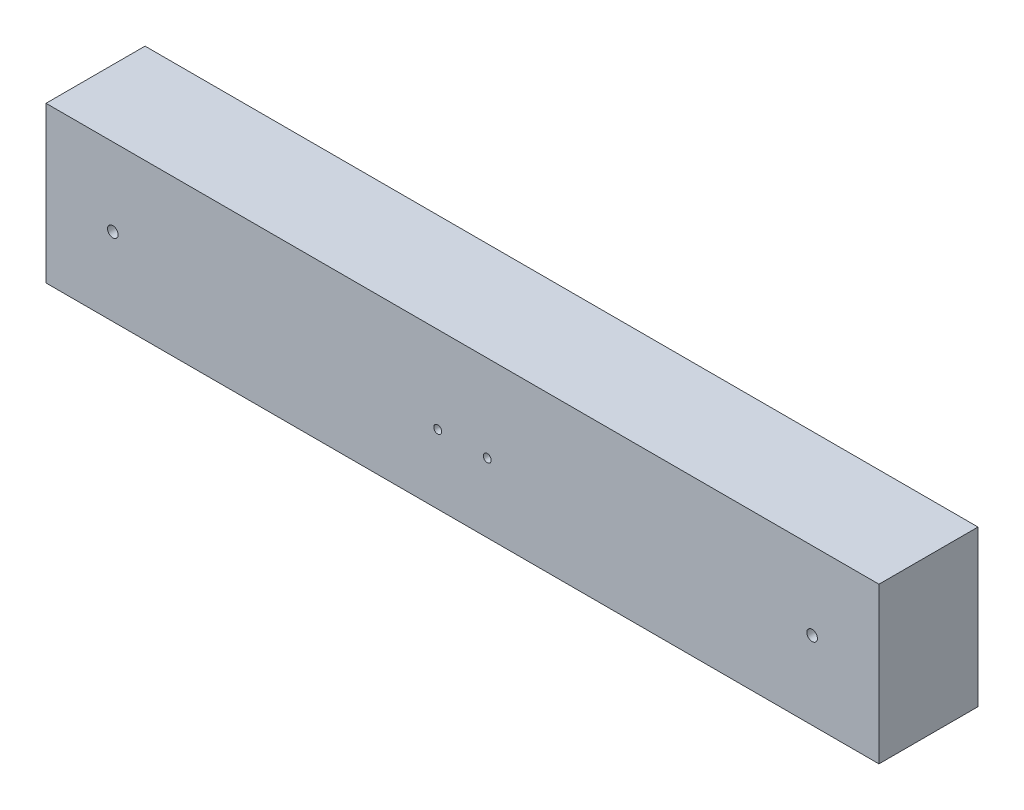
ISO-10303-21;
HEADER;
FILE_DESCRIPTION(('STEP AP214'),'2;1');
FILE_NAME('part.step','',(''),(''),'','','');
FILE_SCHEMA(('AUTOMOTIVE_DESIGN { 1 0 10303 214 1 1 1 1 }'));
ENDSEC;
DATA;
#1=APPLICATION_CONTEXT('core data for automotive mechanical design processes');
#2=APPLICATION_PROTOCOL_DEFINITION('international standard','automotive_design',2000,#1);
#3=PRODUCT_CONTEXT('',#1,'mechanical');
#4=PRODUCT('Part','Part','',(#3));
#5=PRODUCT_RELATED_PRODUCT_CATEGORY('part','',(#4));
#6=PRODUCT_DEFINITION_FORMATION('','',#4);
#7=PRODUCT_DEFINITION_CONTEXT('part definition',#1,'design');
#8=PRODUCT_DEFINITION('design','',#6,#7);
#9=PRODUCT_DEFINITION_SHAPE('','',#8);
#10=(LENGTH_UNIT() NAMED_UNIT(*) SI_UNIT(.MILLI.,.METRE.));
#11=(NAMED_UNIT(*) PLANE_ANGLE_UNIT() SI_UNIT($,.RADIAN.));
#12=(NAMED_UNIT(*) SI_UNIT($,.STERADIAN.) SOLID_ANGLE_UNIT());
#13=UNCERTAINTY_MEASURE_WITH_UNIT(LENGTH_MEASURE(1.E-05),#10,'distance_accuracy_value','');
#14=(GEOMETRIC_REPRESENTATION_CONTEXT(3) GLOBAL_UNCERTAINTY_ASSIGNED_CONTEXT((#13)) GLOBAL_UNIT_ASSIGNED_CONTEXT((#10,
#11,#12)) REPRESENTATION_CONTEXT('',''));
#15=CARTESIAN_POINT('',(0.,0.,0.));
#16=DIRECTION('',(0.,0.,1.));
#17=DIRECTION('',(1.,0.,0.));
#18=AXIS2_PLACEMENT_3D('',#15,#16,#17);
#19=CARTESIAN_POINT('',(373.8626,-69.85,88.9));
#20=DIRECTION('',(-1.,0.,0.));
#21=DIRECTION('',(0.,0.,1.));
#22=AXIS2_PLACEMENT_3D('',#19,#20,#21);
#23=PLANE('',#22);
#24=DIRECTION('',(0.,1.,0.));
#25=VECTOR('',#24,1.);
#26=CARTESIAN_POINT('',(373.8626,-69.85,0.));
#27=LINE('',#26,#25);
#28=CARTESIAN_POINT('',(373.8626,-69.85,0.));
#29=VERTEX_POINT('',#28);
#30=CARTESIAN_POINT('',(373.8626,69.85,0.));
#31=VERTEX_POINT('',#30);
#32=EDGE_CURVE('E97',#29,#31,#27,.T.);
#33=ORIENTED_EDGE('',*,*,#32,.T.);
#34=DIRECTION('',(0.,0.,-1.));
#35=VECTOR('',#34,1.);
#36=CARTESIAN_POINT('',(373.8626,69.85,88.9));
#37=LINE('',#36,#35);
#38=CARTESIAN_POINT('',(373.8626,69.85,88.9));
#39=VERTEX_POINT('',#38);
#40=EDGE_CURVE('E11',#39,#31,#37,.T.);
#41=ORIENTED_EDGE('',*,*,#40,.F.);
#42=DIRECTION('',(0.,1.,0.));
#43=VECTOR('',#42,1.);
#44=CARTESIAN_POINT('',(373.8626,-69.85,88.9));
#45=LINE('',#44,#43);
#46=CARTESIAN_POINT('',(373.8626,-69.85,88.9));
#47=VERTEX_POINT('',#46);
#48=EDGE_CURVE('E85',#47,#39,#45,.T.);
#49=ORIENTED_EDGE('',*,*,#48,.F.);
#50=DIRECTION('',(0.,0.,-1.));
#51=VECTOR('',#50,1.);
#52=CARTESIAN_POINT('',(373.8626,-69.85,88.9));
#53=LINE('',#52,#51);
#54=EDGE_CURVE('E93',#47,#29,#53,.T.);
#55=ORIENTED_EDGE('',*,*,#54,.T.);
#56=EDGE_LOOP('',(#33,#41,#49,#55));
#57=FACE_BOUND('',#56,.T.);
#58=ADVANCED_FACE('F34',(#57),#23,.F.);
#59=CARTESIAN_POINT('',(-373.8626,69.85,88.9));
#60=DIRECTION('',(0.,-1.,0.));
#61=DIRECTION('',(0.,0.,-1.));
#62=AXIS2_PLACEMENT_3D('',#59,#60,#61);
#63=PLANE('',#62);
#64=DIRECTION('',(-1.,0.,0.));
#65=VECTOR('',#64,1.);
#66=CARTESIAN_POINT('',(-373.8626,69.85,0.));
#67=LINE('',#66,#65);
#68=CARTESIAN_POINT('',(-373.8626,69.85,0.));
#69=VERTEX_POINT('',#68);
#70=EDGE_CURVE('E89',#31,#69,#67,.T.);
#71=ORIENTED_EDGE('',*,*,#70,.T.);
#72=DIRECTION('',(0.,0.,-1.));
#73=VECTOR('',#72,1.);
#74=CARTESIAN_POINT('',(-373.8626,69.85,88.9));
#75=LINE('',#74,#73);
#76=CARTESIAN_POINT('',(-373.8626,69.85,88.9));
#77=VERTEX_POINT('',#76);
#78=EDGE_CURVE('E42',#77,#69,#75,.T.);
#79=ORIENTED_EDGE('',*,*,#78,.F.);
#80=DIRECTION('',(-1.,0.,0.));
#81=VECTOR('',#80,1.);
#82=CARTESIAN_POINT('',(-373.8626,69.85,88.9));
#83=LINE('',#82,#81);
#84=EDGE_CURVE('E80',#39,#77,#83,.T.);
#85=ORIENTED_EDGE('',*,*,#84,.F.);
#86=ORIENTED_EDGE('',*,*,#40,.T.);
#87=EDGE_LOOP('',(#71,#79,#85,#86));
#88=FACE_BOUND('',#87,.T.);
#89=ADVANCED_FACE('F88',(#88),#63,.F.);
#90=CARTESIAN_POINT('',(-373.8626,-69.85,88.9));
#91=DIRECTION('',(1.,0.,0.));
#92=DIRECTION('',(0.,0.,-1.));
#93=AXIS2_PLACEMENT_3D('',#90,#91,#92);
#94=PLANE('',#93);
#95=DIRECTION('',(0.,-1.,0.));
#96=VECTOR('',#95,1.);
#97=CARTESIAN_POINT('',(-373.8626,-69.85,0.));
#98=LINE('',#97,#96);
#99=CARTESIAN_POINT('',(-373.8626,-69.85,0.));
#100=VERTEX_POINT('',#99);
#101=EDGE_CURVE('E67',#69,#100,#98,.T.);
#102=ORIENTED_EDGE('',*,*,#101,.T.);
#103=DIRECTION('',(0.,0.,-1.));
#104=VECTOR('',#103,1.);
#105=CARTESIAN_POINT('',(-373.8626,-69.85,88.9));
#106=LINE('',#105,#104);
#107=CARTESIAN_POINT('',(-373.8626,-69.85,88.9));
#108=VERTEX_POINT('',#107);
#109=EDGE_CURVE('E90',#108,#100,#106,.T.);
#110=ORIENTED_EDGE('',*,*,#109,.F.);
#111=DIRECTION('',(0.,-1.,0.));
#112=VECTOR('',#111,1.);
#113=CARTESIAN_POINT('',(-373.8626,-69.85,88.9));
#114=LINE('',#113,#112);
#115=EDGE_CURVE('E83',#77,#108,#114,.T.);
#116=ORIENTED_EDGE('',*,*,#115,.F.);
#117=ORIENTED_EDGE('',*,*,#78,.T.);
#118=EDGE_LOOP('',(#102,#110,#116,#117));
#119=FACE_BOUND('',#118,.T.);
#120=ADVANCED_FACE('F91',(#119),#94,.F.);
#121=CARTESIAN_POINT('',(-373.8626,-69.85,88.9));
#122=DIRECTION('',(0.,1.,0.));
#123=DIRECTION('',(0.,0.,1.));
#124=AXIS2_PLACEMENT_3D('',#121,#122,#123);
#125=PLANE('',#124);
#126=DIRECTION('',(1.,0.,0.));
#127=VECTOR('',#126,1.);
#128=CARTESIAN_POINT('',(-373.8626,-69.85,0.));
#129=LINE('',#128,#127);
#130=EDGE_CURVE('E73',#100,#29,#129,.T.);
#131=ORIENTED_EDGE('',*,*,#130,.T.);
#132=ORIENTED_EDGE('',*,*,#54,.F.);
#133=DIRECTION('',(1.,0.,0.));
#134=VECTOR('',#133,1.);
#135=CARTESIAN_POINT('',(-373.8626,-69.85,88.9));
#136=LINE('',#135,#134);
#137=EDGE_CURVE('E50',#108,#47,#136,.T.);
#138=ORIENTED_EDGE('',*,*,#137,.F.);
#139=ORIENTED_EDGE('',*,*,#109,.T.);
#140=EDGE_LOOP('',(#131,#132,#138,#139));
#141=FACE_BOUND('',#140,.T.);
#142=ADVANCED_FACE('F105',(#141),#125,.F.);
#143=CARTESIAN_POINT('',(0.,0.,88.9));
#144=DIRECTION('',(0.,0.,-1.));
#145=DIRECTION('',(-1.,0.,0.));
#146=AXIS2_PLACEMENT_3D('',#143,#144,#145);
#147=PLANE('',#146);
#148=CARTESIAN_POINT('',(-22.225,-7.88669999999989,88.9));
#149=DIRECTION('',(0.,0.,1.));
#150=DIRECTION('',(1.,0.,0.));
#151=AXIS2_PLACEMENT_3D('',#148,#149,#150);
#152=CIRCLE('',#151,3.57187499999999);
#153=CARTESIAN_POINT('',(-18.653125,-7.88669999999989,88.9));
#154=VERTEX_POINT('',#153);
#155=EDGE_CURVE('E129',#154,#154,#152,.T.);
#156=ORIENTED_EDGE('',*,*,#155,.F.);
#157=EDGE_LOOP('',(#156));
#158=FACE_BOUND('',#157,.T.);
#159=CARTESIAN_POINT('',(22.225,-7.88669999999995,88.9));
#160=DIRECTION('',(0.,0.,1.));
#161=DIRECTION('',(1.,0.,0.));
#162=AXIS2_PLACEMENT_3D('',#159,#160,#161);
#163=CIRCLE('',#162,3.57187499999999);
#164=CARTESIAN_POINT('',(25.796875,-7.88669999999995,88.9));
#165=VERTEX_POINT('',#164);
#166=EDGE_CURVE('E126',#165,#165,#163,.T.);
#167=ORIENTED_EDGE('',*,*,#166,.F.);
#168=EDGE_LOOP('',(#167));
#169=FACE_BOUND('',#168,.T.);
#170=CARTESIAN_POINT('',(-313.8626,0.,88.9));
#171=DIRECTION('',(0.,0.,1.));
#172=DIRECTION('',(1.,0.,0.));
#173=AXIS2_PLACEMENT_3D('',#170,#171,#172);
#174=CIRCLE('',#173,4.76250000000001);
#175=CARTESIAN_POINT('',(-309.1001,0.,88.9));
#176=VERTEX_POINT('',#175);
#177=EDGE_CURVE('E118',#176,#176,#174,.T.);
#178=ORIENTED_EDGE('',*,*,#177,.F.);
#179=EDGE_LOOP('',(#178));
#180=FACE_BOUND('',#179,.T.);
#181=CARTESIAN_POINT('',(313.8626,0.,88.9));
#182=DIRECTION('',(0.,0.,1.));
#183=DIRECTION('',(1.,0.,0.));
#184=AXIS2_PLACEMENT_3D('',#181,#182,#183);
#185=CIRCLE('',#184,4.76250000000001);
#186=CARTESIAN_POINT('',(318.6251,0.,88.9));
#187=VERTEX_POINT('',#186);
#188=EDGE_CURVE('E111',#187,#187,#185,.T.);
#189=ORIENTED_EDGE('',*,*,#188,.F.);
#190=EDGE_LOOP('',(#189));
#191=FACE_BOUND('',#190,.T.);
#192=ORIENTED_EDGE('',*,*,#48,.T.);
#193=ORIENTED_EDGE('',*,*,#84,.T.);
#194=ORIENTED_EDGE('',*,*,#115,.T.);
#195=ORIENTED_EDGE('',*,*,#137,.T.);
#196=EDGE_LOOP('',(#192,#193,#194,#195));
#197=FACE_BOUND('',#196,.T.);
#198=ADVANCED_FACE('F81',(#158,#169,#180,#191,#197),#147,.F.);
#199=CARTESIAN_POINT('',(0.,0.,0.));
#200=DIRECTION('',(0.,0.,-1.));
#201=DIRECTION('',(-1.,0.,0.));
#202=AXIS2_PLACEMENT_3D('',#199,#200,#201);
#203=PLANE('',#202);
#204=CARTESIAN_POINT('',(-22.225,-7.88669999999989,0.));
#205=DIRECTION('',(0.,0.,1.));
#206=DIRECTION('',(1.,0.,0.));
#207=AXIS2_PLACEMENT_3D('',#204,#205,#206);
#208=CIRCLE('',#207,3.57187499999999);
#209=CARTESIAN_POINT('',(-18.653125,-7.88669999999989,0.));
#210=VERTEX_POINT('',#209);
#211=EDGE_CURVE('E115',#210,#210,#208,.T.);
#212=ORIENTED_EDGE('',*,*,#211,.T.);
#213=EDGE_LOOP('',(#212));
#214=FACE_BOUND('',#213,.T.);
#215=CARTESIAN_POINT('',(22.225,-7.88669999999995,0.));
#216=DIRECTION('',(0.,0.,1.));
#217=DIRECTION('',(1.,0.,0.));
#218=AXIS2_PLACEMENT_3D('',#215,#216,#217);
#219=CIRCLE('',#218,3.57187499999999);
#220=CARTESIAN_POINT('',(25.796875,-7.88669999999995,0.));
#221=VERTEX_POINT('',#220);
#222=EDGE_CURVE('E123',#221,#221,#219,.T.);
#223=ORIENTED_EDGE('',*,*,#222,.T.);
#224=EDGE_LOOP('',(#223));
#225=FACE_BOUND('',#224,.T.);
#226=CARTESIAN_POINT('',(-313.8626,0.,0.));
#227=DIRECTION('',(0.,0.,1.));
#228=DIRECTION('',(1.,0.,0.));
#229=AXIS2_PLACEMENT_3D('',#226,#227,#228);
#230=CIRCLE('',#229,4.76250000000001);
#231=CARTESIAN_POINT('',(-309.1001,0.,0.));
#232=VERTEX_POINT('',#231);
#233=EDGE_CURVE('E100',#232,#232,#230,.T.);
#234=ORIENTED_EDGE('',*,*,#233,.T.);
#235=EDGE_LOOP('',(#234));
#236=FACE_BOUND('',#235,.T.);
#237=CARTESIAN_POINT('',(313.8626,0.,0.));
#238=DIRECTION('',(0.,0.,1.));
#239=DIRECTION('',(1.,0.,0.));
#240=AXIS2_PLACEMENT_3D('',#237,#238,#239);
#241=CIRCLE('',#240,4.76250000000001);
#242=CARTESIAN_POINT('',(318.6251,0.,0.));
#243=VERTEX_POINT('',#242);
#244=EDGE_CURVE('E114',#243,#243,#241,.T.);
#245=ORIENTED_EDGE('',*,*,#244,.T.);
#246=EDGE_LOOP('',(#245));
#247=FACE_BOUND('',#246,.T.);
#248=ORIENTED_EDGE('',*,*,#32,.F.);
#249=ORIENTED_EDGE('',*,*,#130,.F.);
#250=ORIENTED_EDGE('',*,*,#101,.F.);
#251=ORIENTED_EDGE('',*,*,#70,.F.);
#252=EDGE_LOOP('',(#248,#249,#250,#251));
#253=FACE_BOUND('',#252,.T.);
#254=ADVANCED_FACE('F108',(#214,#225,#236,#247,#253),#203,.T.);
#255=CARTESIAN_POINT('',(313.8626,0.,0.));
#256=DIRECTION('',(0.,0.,1.));
#257=DIRECTION('',(1.,0.,0.));
#258=AXIS2_PLACEMENT_3D('',#255,#256,#257);
#259=CYLINDRICAL_SURFACE('',#258,4.76250000000001);
#260=ORIENTED_EDGE('',*,*,#244,.F.);
#261=EDGE_LOOP('',(#260));
#262=FACE_BOUND('',#261,.T.);
#263=ORIENTED_EDGE('',*,*,#188,.T.);
#264=EDGE_LOOP('',(#263));
#265=FACE_BOUND('',#264,.T.);
#266=ADVANCED_FACE('F153',(#262,#265),#259,.F.);
#267=CARTESIAN_POINT('',(-313.8626,0.,0.));
#268=DIRECTION('',(0.,0.,1.));
#269=DIRECTION('',(1.,0.,0.));
#270=AXIS2_PLACEMENT_3D('',#267,#268,#269);
#271=CYLINDRICAL_SURFACE('',#270,4.76250000000001);
#272=ORIENTED_EDGE('',*,*,#233,.F.);
#273=EDGE_LOOP('',(#272));
#274=FACE_BOUND('',#273,.T.);
#275=ORIENTED_EDGE('',*,*,#177,.T.);
#276=EDGE_LOOP('',(#275));
#277=FACE_BOUND('',#276,.T.);
#278=ADVANCED_FACE('F155',(#274,#277),#271,.F.);
#279=CARTESIAN_POINT('',(22.225,-7.88669999999995,0.));
#280=DIRECTION('',(0.,0.,1.));
#281=DIRECTION('',(1.,0.,0.));
#282=AXIS2_PLACEMENT_3D('',#279,#280,#281);
#283=CYLINDRICAL_SURFACE('',#282,3.57187499999999);
#284=ORIENTED_EDGE('',*,*,#222,.F.);
#285=EDGE_LOOP('',(#284));
#286=FACE_BOUND('',#285,.T.);
#287=ORIENTED_EDGE('',*,*,#166,.T.);
#288=EDGE_LOOP('',(#287));
#289=FACE_BOUND('',#288,.T.);
#290=ADVANCED_FACE('F140',(#286,#289),#283,.F.);
#291=CARTESIAN_POINT('',(-22.225,-7.88669999999989,0.));
#292=DIRECTION('',(0.,0.,1.));
#293=DIRECTION('',(1.,0.,0.));
#294=AXIS2_PLACEMENT_3D('',#291,#292,#293);
#295=CYLINDRICAL_SURFACE('',#294,3.57187499999999);
#296=ORIENTED_EDGE('',*,*,#211,.F.);
#297=EDGE_LOOP('',(#296));
#298=FACE_BOUND('',#297,.T.);
#299=ORIENTED_EDGE('',*,*,#155,.T.);
#300=EDGE_LOOP('',(#299));
#301=FACE_BOUND('',#300,.T.);
#302=ADVANCED_FACE('F137',(#298,#301),#295,.F.);
#303=CLOSED_SHELL('',(#58,#89,#120,#142,#198,#254,#266,#278,#290,#302));
#304=MANIFOLD_SOLID_BREP('B2',#303);
#305=ADVANCED_BREP_SHAPE_REPRESENTATION('',(#18,#304),#14);
#306=SHAPE_DEFINITION_REPRESENTATION(#9,#305);
ENDSEC;
END-ISO-10303-21;
